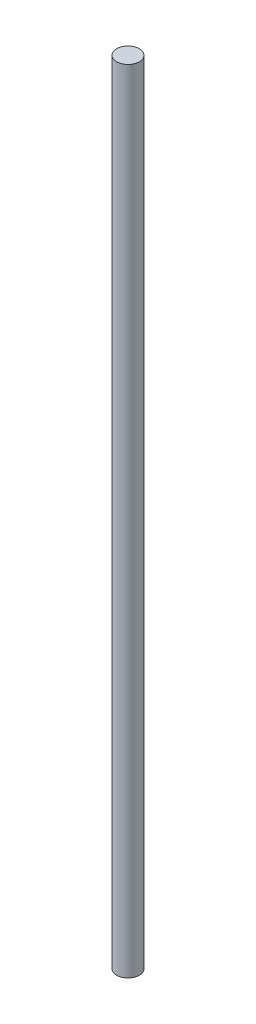
ISO-10303-21;
HEADER;
FILE_DESCRIPTION(('STEP AP214'),'2;1');
FILE_NAME('part.step','',(''),(''),'','','');
FILE_SCHEMA(('AUTOMOTIVE_DESIGN { 1 0 10303 214 1 1 1 1 }'));
ENDSEC;
DATA;
#1=APPLICATION_CONTEXT('core data for automotive mechanical design processes');
#2=APPLICATION_PROTOCOL_DEFINITION('international standard','automotive_design',2000,#1);
#3=PRODUCT_CONTEXT('',#1,'mechanical');
#4=PRODUCT('Part','Part','',(#3));
#5=PRODUCT_RELATED_PRODUCT_CATEGORY('part','',(#4));
#6=PRODUCT_DEFINITION_FORMATION('','',#4);
#7=PRODUCT_DEFINITION_CONTEXT('part definition',#1,'design');
#8=PRODUCT_DEFINITION('design','',#6,#7);
#9=PRODUCT_DEFINITION_SHAPE('','',#8);
#10=(LENGTH_UNIT() NAMED_UNIT(*) SI_UNIT(.MILLI.,.METRE.));
#11=(NAMED_UNIT(*) PLANE_ANGLE_UNIT() SI_UNIT($,.RADIAN.));
#12=(NAMED_UNIT(*) SI_UNIT($,.STERADIAN.) SOLID_ANGLE_UNIT());
#13=UNCERTAINTY_MEASURE_WITH_UNIT(LENGTH_MEASURE(1.E-05),#10,'distance_accuracy_value','');
#14=(GEOMETRIC_REPRESENTATION_CONTEXT(3) GLOBAL_UNCERTAINTY_ASSIGNED_CONTEXT((#13)) GLOBAL_UNIT_ASSIGNED_CONTEXT((#10,
#11,#12)) REPRESENTATION_CONTEXT('',''));
#15=CARTESIAN_POINT('',(0.,0.,0.));
#16=DIRECTION('',(0.,0.,1.));
#17=DIRECTION('',(1.,0.,0.));
#18=AXIS2_PLACEMENT_3D('',#15,#16,#17);
#19=CARTESIAN_POINT('',(0.,280.,0.));
#20=DIRECTION('',(0.,-1.,0.));
#21=DIRECTION('',(0.,0.,-1.));
#22=AXIS2_PLACEMENT_3D('',#19,#20,#21);
#23=CYLINDRICAL_SURFACE('',#22,4.);
#24=CARTESIAN_POINT('',(0.,280.,0.));
#25=DIRECTION('',(0.,1.,0.));
#26=DIRECTION('',(0.,0.,1.));
#27=AXIS2_PLACEMENT_3D('',#24,#25,#26);
#28=CIRCLE('',#27,4.);
#29=CARTESIAN_POINT('',(0.,280.,4.));
#30=VERTEX_POINT('',#29);
#31=EDGE_CURVE('E10',#30,#30,#28,.T.);
#32=ORIENTED_EDGE('',*,*,#31,.F.);
#33=EDGE_LOOP('',(#32));
#34=FACE_BOUND('',#33,.T.);
#35=CARTESIAN_POINT('',(0.,0.,0.));
#36=DIRECTION('',(0.,1.,0.));
#37=DIRECTION('',(0.,0.,1.));
#38=AXIS2_PLACEMENT_3D('',#35,#36,#37);
#39=CIRCLE('',#38,4.);
#40=CARTESIAN_POINT('',(0.,0.,4.));
#41=VERTEX_POINT('',#40);
#42=EDGE_CURVE('E34',#41,#41,#39,.T.);
#43=ORIENTED_EDGE('',*,*,#42,.T.);
#44=EDGE_LOOP('',(#43));
#45=FACE_BOUND('',#44,.T.);
#46=ADVANCED_FACE('F31',(#34,#45),#23,.T.);
#47=CARTESIAN_POINT('',(0.,280.,0.));
#48=DIRECTION('',(0.,1.,0.));
#49=DIRECTION('',(0.,0.,1.));
#50=AXIS2_PLACEMENT_3D('',#47,#48,#49);
#51=PLANE('',#50);
#52=ORIENTED_EDGE('',*,*,#31,.T.);
#53=EDGE_LOOP('',(#52));
#54=FACE_BOUND('',#53,.T.);
#55=ADVANCED_FACE('F46',(#54),#51,.T.);
#56=CARTESIAN_POINT('',(0.,0.,0.));
#57=DIRECTION('',(0.,1.,0.));
#58=DIRECTION('',(0.,0.,1.));
#59=AXIS2_PLACEMENT_3D('',#56,#57,#58);
#60=PLANE('',#59);
#61=ORIENTED_EDGE('',*,*,#42,.F.);
#62=EDGE_LOOP('',(#61));
#63=FACE_BOUND('',#62,.T.);
#64=ADVANCED_FACE('F44',(#63),#60,.F.);
#65=CLOSED_SHELL('',(#46,#55,#64));
#66=MANIFOLD_SOLID_BREP('B2',#65);
#67=ADVANCED_BREP_SHAPE_REPRESENTATION('',(#18,#66),#14);
#68=SHAPE_DEFINITION_REPRESENTATION(#9,#67);
ENDSEC;
END-ISO-10303-21;
